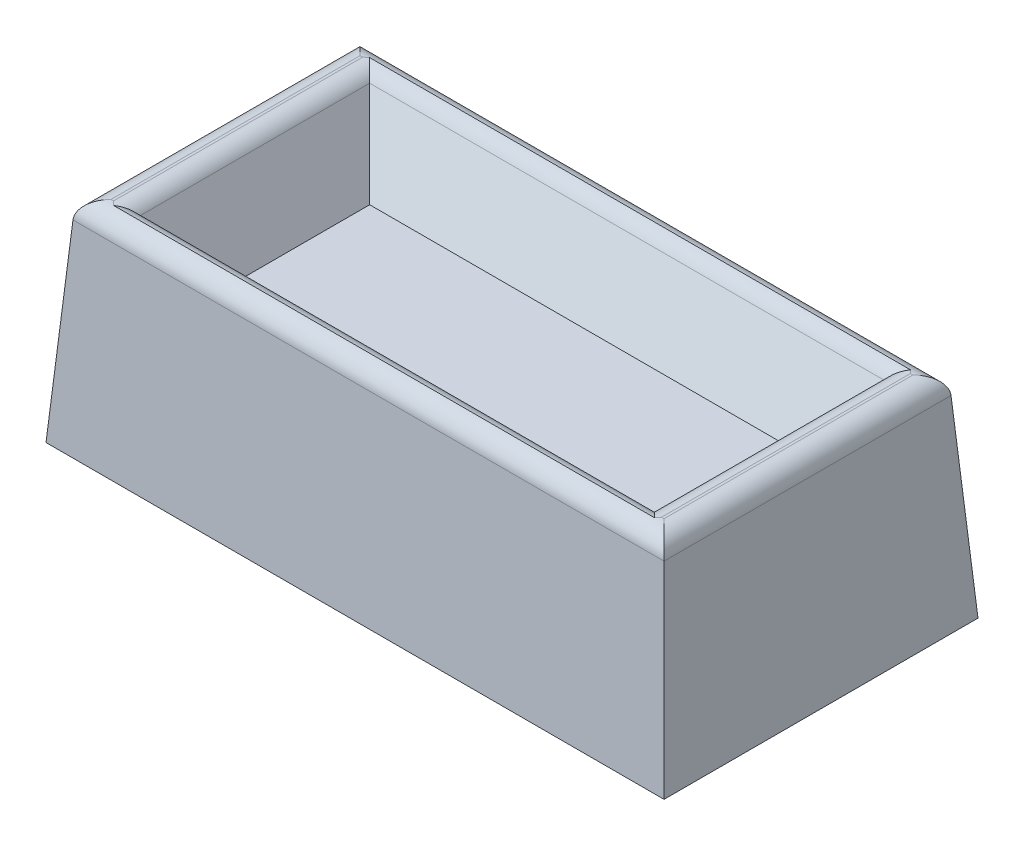
ISO-10303-21;
HEADER;
FILE_DESCRIPTION(('STEP AP214'),'2;1');
FILE_NAME('part.step','',(''),(''),'','','');
FILE_SCHEMA(('AUTOMOTIVE_DESIGN { 1 0 10303 214 1 1 1 1 }'));
ENDSEC;
DATA;
#1=APPLICATION_CONTEXT('core data for automotive mechanical design processes');
#2=APPLICATION_PROTOCOL_DEFINITION('international standard','automotive_design',2000,#1);
#3=PRODUCT_CONTEXT('',#1,'mechanical');
#4=PRODUCT('Part','Part','',(#3));
#5=PRODUCT_RELATED_PRODUCT_CATEGORY('part','',(#4));
#6=PRODUCT_DEFINITION_FORMATION('','',#4);
#7=PRODUCT_DEFINITION_CONTEXT('part definition',#1,'design');
#8=PRODUCT_DEFINITION('design','',#6,#7);
#9=PRODUCT_DEFINITION_SHAPE('','',#8);
#10=(LENGTH_UNIT() NAMED_UNIT(*) SI_UNIT(.MILLI.,.METRE.));
#11=(NAMED_UNIT(*) PLANE_ANGLE_UNIT() SI_UNIT($,.RADIAN.));
#12=(NAMED_UNIT(*) SI_UNIT($,.STERADIAN.) SOLID_ANGLE_UNIT());
#13=UNCERTAINTY_MEASURE_WITH_UNIT(LENGTH_MEASURE(1.E-05),#10,'distance_accuracy_value','');
#14=(GEOMETRIC_REPRESENTATION_CONTEXT(3) GLOBAL_UNCERTAINTY_ASSIGNED_CONTEXT((#13)) GLOBAL_UNIT_ASSIGNED_CONTEXT((#10,
#11,#12)) REPRESENTATION_CONTEXT('',''));
#15=CARTESIAN_POINT('',(0.,0.,0.));
#16=DIRECTION('',(0.,0.,1.));
#17=DIRECTION('',(1.,0.,0.));
#18=AXIS2_PLACEMENT_3D('',#15,#16,#17);
#19=CARTESIAN_POINT('',(0.,0.,0.));
#20=DIRECTION('',(0.,-1.,0.));
#21=DIRECTION('',(0.,0.,-1.));
#22=AXIS2_PLACEMENT_3D('',#19,#20,#21);
#23=PLANE('',#22);
#24=DIRECTION('',(0.,0.,-1.));
#25=VECTOR('',#24,1.);
#26=CARTESIAN_POINT('',(102.892841401862,0.,52.2673742227546));
#27=LINE('',#26,#25);
#28=CARTESIAN_POINT('',(102.892841401862,0.,52.2673742227546));
#29=VERTEX_POINT('',#28);
#30=CARTESIAN_POINT('',(102.892841401862,0.,-52.2673742227546));
#31=VERTEX_POINT('',#30);
#32=EDGE_CURVE('E234',#29,#31,#27,.T.);
#33=ORIENTED_EDGE('',*,*,#32,.F.);
#34=DIRECTION('',(1.,0.,0.));
#35=VECTOR('',#34,1.);
#36=CARTESIAN_POINT('',(-102.892841401862,0.,52.2673742227546));
#37=LINE('',#36,#35);
#38=CARTESIAN_POINT('',(-102.892841401862,0.,52.2673742227546));
#39=VERTEX_POINT('',#38);
#40=EDGE_CURVE('E244',#39,#29,#37,.T.);
#41=ORIENTED_EDGE('',*,*,#40,.F.);
#42=DIRECTION('',(0.,0.,1.));
#43=VECTOR('',#42,1.);
#44=CARTESIAN_POINT('',(-102.892841401862,0.,52.2673742227546));
#45=LINE('',#44,#43);
#46=CARTESIAN_POINT('',(-102.892841401862,0.,-52.2673742227546));
#47=VERTEX_POINT('',#46);
#48=EDGE_CURVE('E241',#47,#39,#45,.T.);
#49=ORIENTED_EDGE('',*,*,#48,.F.);
#50=DIRECTION('',(-1.,0.,0.));
#51=VECTOR('',#50,1.);
#52=CARTESIAN_POINT('',(-102.892841401862,0.,-52.2673742227546));
#53=LINE('',#52,#51);
#54=EDGE_CURVE('E237',#31,#47,#53,.T.);
#55=ORIENTED_EDGE('',*,*,#54,.F.);
#56=EDGE_LOOP('',(#33,#41,#49,#55));
#57=FACE_BOUND('',#56,.T.);
#58=DIRECTION('',(0.,0.,-1.));
#59=VECTOR('',#58,1.);
#60=CARTESIAN_POINT('',(-55.8683845017869,0.,25.4870488631695));
#61=LINE('',#60,#59);
#62=CARTESIAN_POINT('',(-55.8683845017869,0.,-44.6287669593761));
#63=VERTEX_POINT('',#62);
#64=CARTESIAN_POINT('',(-55.8683845017869,0.,44.6287669593761));
#65=VERTEX_POINT('',#64);
#66=EDGE_CURVE('E218',#63,#65,#61,.F.);
#67=ORIENTED_EDGE('',*,*,#66,.F.);
#68=DIRECTION('',(1.,0.,0.));
#69=VECTOR('',#68,1.);
#70=CARTESIAN_POINT('',(0.,0.,-44.6287669593761));
#71=LINE('',#70,#69);
#72=CARTESIAN_POINT('',(-95.254234138484,0.,-44.6287669593761));
#73=VERTEX_POINT('',#72);
#74=EDGE_CURVE('E207',#63,#73,#71,.F.);
#75=ORIENTED_EDGE('',*,*,#74,.T.);
#76=DIRECTION('',(0.,0.,-1.));
#77=VECTOR('',#76,1.);
#78=CARTESIAN_POINT('',(-95.254234138484,0.,0.));
#79=LINE('',#78,#77);
#80=CARTESIAN_POINT('',(-95.254234138484,0.,44.6287669593761));
#81=VERTEX_POINT('',#80);
#82=EDGE_CURVE('E209',#73,#81,#79,.F.);
#83=ORIENTED_EDGE('',*,*,#82,.T.);
#84=DIRECTION('',(-1.,0.,0.));
#85=VECTOR('',#84,1.);
#86=CARTESIAN_POINT('',(0.,0.,44.6287669593761));
#87=LINE('',#86,#85);
#88=EDGE_CURVE('E62',#81,#65,#87,.F.);
#89=ORIENTED_EDGE('',*,*,#88,.T.);
#90=EDGE_LOOP('',(#67,#75,#83,#89));
#91=FACE_BOUND('',#90,.T.);
#92=CARTESIAN_POINT('',(95.254234138484,0.,-44.6287669593761));
#93=VERTEX_POINT('',#92);
#94=CARTESIAN_POINT('',(55.8683845017869,0.,-44.6287669593761));
#95=VERTEX_POINT('',#94);
#96=EDGE_CURVE('E212',#93,#95,#71,.F.);
#97=ORIENTED_EDGE('',*,*,#96,.T.);
#98=DIRECTION('',(0.,0.,-1.));
#99=VECTOR('',#98,1.);
#100=CARTESIAN_POINT('',(55.8683845017869,0.,0.));
#101=LINE('',#100,#99);
#102=CARTESIAN_POINT('',(55.8683845017869,0.,44.6287669593761));
#103=VERTEX_POINT('',#102);
#104=EDGE_CURVE('E205',#95,#103,#101,.F.);
#105=ORIENTED_EDGE('',*,*,#104,.T.);
#106=CARTESIAN_POINT('',(95.254234138484,0.,44.6287669593761));
#107=VERTEX_POINT('',#106);
#108=EDGE_CURVE('E196',#103,#107,#87,.F.);
#109=ORIENTED_EDGE('',*,*,#108,.T.);
#110=DIRECTION('',(0.,0.,1.));
#111=VECTOR('',#110,1.);
#112=CARTESIAN_POINT('',(95.254234138484,0.,0.));
#113=LINE('',#112,#111);
#114=EDGE_CURVE('E54',#107,#93,#113,.F.);
#115=ORIENTED_EDGE('',*,*,#114,.T.);
#116=EDGE_LOOP('',(#97,#105,#109,#115));
#117=FACE_BOUND('',#116,.T.);
#118=ADVANCED_FACE('F37',(#57,#91,#117),#23,.T.);
#119=CARTESIAN_POINT('',(0.,70.104,0.));
#120=DIRECTION('',(0.,-1.,0.));
#121=DIRECTION('',(0.,0.,-1.));
#122=AXIS2_PLACEMENT_3D('',#119,#120,#121);
#123=PLANE('',#122);
#124=DIRECTION('',(0.,0.,-1.));
#125=VECTOR('',#124,1.);
#126=CARTESIAN_POINT('',(-92.0692213804005,70.104,0.));
#127=LINE('',#126,#125);
#128=CARTESIAN_POINT('',(-92.0692213804005,70.104,-41.4437542012926));
#129=VERTEX_POINT('',#128);
#130=CARTESIAN_POINT('',(-92.0692213804005,70.104,41.4437542012926));
#131=VERTEX_POINT('',#130);
#132=EDGE_CURVE('E278',#129,#131,#127,.F.);
#133=ORIENTED_EDGE('',*,*,#132,.T.);
#134=DIRECTION('',(-1.,0.,0.));
#135=VECTOR('',#134,1.);
#136=CARTESIAN_POINT('',(0.,70.104,41.4437542012926));
#137=LINE('',#136,#135);
#138=CARTESIAN_POINT('',(-91.2103038799607,70.104,41.4437542012926));
#139=VERTEX_POINT('',#138);
#140=EDGE_CURVE('E280',#131,#139,#137,.F.);
#141=ORIENTED_EDGE('',*,*,#140,.T.);
#142=DIRECTION('',(0.,0.,-1.));
#143=VECTOR('',#142,1.);
#144=CARTESIAN_POINT('',(-91.2103038799607,70.104,0.));
#145=LINE('',#144,#143);
#146=CARTESIAN_POINT('',(-91.2103038799607,70.104,-41.4437542012926));
#147=VERTEX_POINT('',#146);
#148=EDGE_CURVE('E274',#139,#147,#145,.T.);
#149=ORIENTED_EDGE('',*,*,#148,.T.);
#150=DIRECTION('',(1.,0.,0.));
#151=VECTOR('',#150,1.);
#152=CARTESIAN_POINT('',(0.,70.104,-41.4437542012926));
#153=LINE('',#152,#151);
#154=EDGE_CURVE('E276',#147,#129,#153,.F.);
#155=ORIENTED_EDGE('',*,*,#154,.T.);
#156=EDGE_LOOP('',(#133,#141,#149,#155));
#157=FACE_BOUND('',#156,.T.);
#158=ADVANCED_FACE('F381',(#157),#123,.F.);
#159=CARTESIAN_POINT('',(102.892841401862,0.,52.2673742227546));
#160=DIRECTION('',(0.997564050259824,0.0697564737441253,0.));
#161=DIRECTION('',(-0.0697564737441253,0.997564050259824,0.));
#162=AXIS2_PLACEMENT_3D('',#159,#160,#161);
#163=PLANE('',#162);
#164=DIRECTION('',(0.0695873743166647,-0.995145815783508,-0.0695873743166647));
#165=VECTOR('',#164,1.);
#166=CARTESIAN_POINT('',(101.896344263182,14.2505730060454,-51.2708770840736));
#167=LINE('',#166,#165);
#168=CARTESIAN_POINT('',(98.4037530995504,64.1969536082752,-47.7782859204425));
#169=VERTEX_POINT('',#168);
#170=EDGE_CURVE('E248',#169,#31,#167,.T.);
#171=ORIENTED_EDGE('',*,*,#170,.F.);
#172=DIRECTION('',(0.,0.,-1.));
#173=VECTOR('',#172,1.);
#174=CARTESIAN_POINT('',(98.4037530995504,64.1969536082752,52.2673742227546));
#175=LINE('',#174,#173);
#176=CARTESIAN_POINT('',(98.4037530995504,64.1969536082752,47.7782859204425));
#177=VERTEX_POINT('',#176);
#178=EDGE_CURVE('E290',#169,#177,#175,.F.);
#179=ORIENTED_EDGE('',*,*,#178,.T.);
#180=DIRECTION('',(0.0695873743166647,-0.995145815783508,0.0695873743166647));
#181=VECTOR('',#180,1.);
#182=CARTESIAN_POINT('',(102.892841401862,0.,52.2673742227546));
#183=LINE('',#182,#181);
#184=EDGE_CURVE('E247',#177,#29,#183,.T.);
#185=ORIENTED_EDGE('',*,*,#184,.T.);
#186=ORIENTED_EDGE('',*,*,#32,.T.);
#187=EDGE_LOOP('',(#171,#179,#185,#186));
#188=FACE_BOUND('',#187,.T.);
#189=ADVANCED_FACE('F361',(#188),#163,.T.);
#190=CARTESIAN_POINT('',(-102.892841401862,0.,-52.2673742227546));
#191=DIRECTION('',(0.,0.0697564737441253,-0.997564050259824));
#192=DIRECTION('',(0.,0.997564050259824,0.0697564737441253));
#193=AXIS2_PLACEMENT_3D('',#190,#191,#192);
#194=PLANE('',#193);
#195=DIRECTION('',(-0.0695873743166647,-0.995145815783508,-0.0695873743166647));
#196=VECTOR('',#195,1.);
#197=CARTESIAN_POINT('',(-102.386642057479,7.23898788339008,-51.7611748783715));
#198=LINE('',#197,#196);
#199=CARTESIAN_POINT('',(-98.4037530995504,64.1969536082752,-47.7782859204425));
#200=VERTEX_POINT('',#199);
#201=EDGE_CURVE('E251',#200,#47,#198,.T.);
#202=ORIENTED_EDGE('',*,*,#201,.F.);
#203=DIRECTION('',(-1.,0.,0.));
#204=VECTOR('',#203,1.);
#205=CARTESIAN_POINT('',(-102.892841401862,64.1969536082752,-47.7782859204425));
#206=LINE('',#205,#204);
#207=EDGE_CURVE('E288',#200,#169,#206,.F.);
#208=ORIENTED_EDGE('',*,*,#207,.T.);
#209=ORIENTED_EDGE('',*,*,#170,.T.);
#210=ORIENTED_EDGE('',*,*,#54,.T.);
#211=EDGE_LOOP('',(#202,#208,#209,#210));
#212=FACE_BOUND('',#211,.T.);
#213=ADVANCED_FACE('F377',(#212),#194,.T.);
#214=CARTESIAN_POINT('',(-102.892841401862,0.,52.2673742227546));
#215=DIRECTION('',(-0.997564050259824,0.0697564737441253,0.));
#216=DIRECTION('',(-0.0697564737441253,-0.997564050259824,0.));
#217=AXIS2_PLACEMENT_3D('',#214,#215,#216);
#218=PLANE('',#217);
#219=DIRECTION('',(-0.0695873743166647,-0.995145815783508,0.0695873743166647));
#220=VECTOR('',#219,1.);
#221=CARTESIAN_POINT('',(-102.892841401862,0.,52.2673742227546));
#222=LINE('',#221,#220);
#223=CARTESIAN_POINT('',(-98.4037530995504,64.1969536082752,47.7782859204425));
#224=VERTEX_POINT('',#223);
#225=EDGE_CURVE('E253',#224,#39,#222,.T.);
#226=ORIENTED_EDGE('',*,*,#225,.F.);
#227=DIRECTION('',(0.,0.,1.));
#228=VECTOR('',#227,1.);
#229=CARTESIAN_POINT('',(-98.4037530995504,64.1969536082752,52.2673742227546));
#230=LINE('',#229,#228);
#231=EDGE_CURVE('E286',#224,#200,#230,.F.);
#232=ORIENTED_EDGE('',*,*,#231,.T.);
#233=ORIENTED_EDGE('',*,*,#201,.T.);
#234=ORIENTED_EDGE('',*,*,#48,.T.);
#235=EDGE_LOOP('',(#226,#232,#233,#234));
#236=FACE_BOUND('',#235,.T.);
#237=ADVANCED_FACE('F375',(#236),#218,.T.);
#238=CARTESIAN_POINT('',(-102.892841401862,0.,52.2673742227546));
#239=DIRECTION('',(0.,0.0697564737441253,0.997564050259824));
#240=DIRECTION('',(0.,-0.997564050259824,0.0697564737441253));
#241=AXIS2_PLACEMENT_3D('',#238,#239,#240);
#242=PLANE('',#241);
#243=ORIENTED_EDGE('',*,*,#184,.F.);
#244=DIRECTION('',(1.,0.,0.));
#245=VECTOR('',#244,1.);
#246=CARTESIAN_POINT('',(-102.892841401862,64.1969536082752,47.7782859204425));
#247=LINE('',#246,#245);
#248=EDGE_CURVE('E283',#177,#224,#247,.F.);
#249=ORIENTED_EDGE('',*,*,#248,.T.);
#250=ORIENTED_EDGE('',*,*,#225,.T.);
#251=ORIENTED_EDGE('',*,*,#40,.T.);
#252=EDGE_LOOP('',(#243,#249,#250,#251));
#253=FACE_BOUND('',#252,.T.);
#254=ADVANCED_FACE('F364',(#253),#242,.T.);
#255=DIRECTION('',(-1.,0.,0.));
#256=VECTOR('',#255,1.);
#257=CARTESIAN_POINT('',(0.,70.104,41.4437542012926));
#258=LINE('',#257,#256);
#259=CARTESIAN_POINT('',(91.2103038799607,70.104,41.4437542012926));
#260=VERTEX_POINT('',#259);
#261=CARTESIAN_POINT('',(92.0692213804005,70.104,41.4437542012926));
#262=VERTEX_POINT('',#261);
#263=EDGE_CURVE('E269',#260,#262,#258,.F.);
#264=ORIENTED_EDGE('',*,*,#263,.T.);
#265=DIRECTION('',(0.,0.,1.));
#266=VECTOR('',#265,1.);
#267=CARTESIAN_POINT('',(92.0692213804005,70.104,0.));
#268=LINE('',#267,#266);
#269=CARTESIAN_POINT('',(92.0692213804005,70.104,-41.4437542012926));
#270=VERTEX_POINT('',#269);
#271=EDGE_CURVE('E272',#262,#270,#268,.F.);
#272=ORIENTED_EDGE('',*,*,#271,.T.);
#273=DIRECTION('',(1.,0.,0.));
#274=VECTOR('',#273,1.);
#275=CARTESIAN_POINT('',(0.,70.104,-41.4437542012926));
#276=LINE('',#275,#274);
#277=CARTESIAN_POINT('',(91.2103038799607,70.104,-41.4437542012926));
#278=VERTEX_POINT('',#277);
#279=EDGE_CURVE('E267',#270,#278,#276,.F.);
#280=ORIENTED_EDGE('',*,*,#279,.T.);
#281=DIRECTION('',(0.,0.,1.));
#282=VECTOR('',#281,1.);
#283=CARTESIAN_POINT('',(91.2103038799607,70.104,0.));
#284=LINE('',#283,#282);
#285=EDGE_CURVE('E250',#278,#260,#284,.T.);
#286=ORIENTED_EDGE('',*,*,#285,.T.);
#287=EDGE_LOOP('',(#264,#272,#280,#286));
#288=FACE_BOUND('',#287,.T.);
#289=ADVANCED_FACE('F351',(#288),#123,.F.);
#290=CARTESIAN_POINT('',(72.8794328331901,44.704,25.4870488631695));
#291=DIRECTION('',(-0.866025403784438,0.500000000000001,0.));
#292=DIRECTION('',(-0.500000000000001,-0.866025403784438,0.));
#293=AXIS2_PLACEMENT_3D('',#290,#291,#292);
#294=PLANE('',#293);
#295=DIRECTION('',(0.447213595499959,0.774596669241482,0.447213595499959));
#296=VECTOR('',#295,1.);
#297=CARTESIAN_POINT('',(43.727659699914,-5.78835219755546,-3.66472427010659));
#298=LINE('',#297,#296);
#299=CARTESIAN_POINT('',(72.8794328331901,44.704,25.4870488631695));
#300=VERTEX_POINT('',#299);
#301=CARTESIAN_POINT('',(85.7110425659296,66.929,38.318658595909));
#302=VERTEX_POINT('',#301);
#303=EDGE_CURVE('E238',#300,#302,#298,.T.);
#304=ORIENTED_EDGE('',*,*,#303,.T.);
#305=DIRECTION('',(0.,0.,-1.));
#306=VECTOR('',#305,1.);
#307=CARTESIAN_POINT('',(85.7110425659296,66.929,25.4870488631695));
#308=LINE('',#307,#306);
#309=CARTESIAN_POINT('',(85.7110425659296,66.929,-38.318658595909));
#310=VERTEX_POINT('',#309);
#311=EDGE_CURVE('E46',#302,#310,#308,.T.);
#312=ORIENTED_EDGE('',*,*,#311,.T.);
#313=DIRECTION('',(0.447213595499959,0.774596669241482,-0.447213595499959));
#314=VECTOR('',#313,1.);
#315=CARTESIAN_POINT('',(62.6846132879222,27.0460545735999,-15.2922293179017));
#316=LINE('',#315,#314);
#317=CARTESIAN_POINT('',(72.8794328331901,44.704,-25.4870488631695));
#318=VERTEX_POINT('',#317);
#319=EDGE_CURVE('E233',#318,#310,#316,.T.);
#320=ORIENTED_EDGE('',*,*,#319,.F.);
#321=DIRECTION('',(0.,0.,-1.));
#322=VECTOR('',#321,1.);
#323=CARTESIAN_POINT('',(72.8794328331901,44.704,25.4870488631695));
#324=LINE('',#323,#322);
#325=EDGE_CURVE('E221',#300,#318,#324,.T.);
#326=ORIENTED_EDGE('',*,*,#325,.F.);
#327=EDGE_LOOP('',(#304,#312,#320,#326));
#328=FACE_BOUND('',#327,.T.);
#329=ADVANCED_FACE('F401',(#328),#294,.T.);
#330=CARTESIAN_POINT('',(-72.8794328331901,44.704,25.4870488631695));
#331=DIRECTION('',(0.,0.500000000000001,-0.866025403784438));
#332=DIRECTION('',(0.,0.866025403784438,0.500000000000001));
#333=AXIS2_PLACEMENT_3D('',#330,#331,#332);
#334=PLANE('',#333);
#335=DIRECTION('',(-0.447213595499959,0.774596669241482,0.447213595499959));
#336=VECTOR('',#335,1.);
#337=CARTESIAN_POINT('',(-72.8794328331901,44.704,25.4870488631695));
#338=LINE('',#337,#336);
#339=CARTESIAN_POINT('',(-72.8794328331901,44.704,25.4870488631695));
#340=VERTEX_POINT('',#339);
#341=CARTESIAN_POINT('',(-85.7110425659296,66.929,38.318658595909));
#342=VERTEX_POINT('',#341);
#343=EDGE_CURVE('E258',#340,#342,#338,.T.);
#344=ORIENTED_EDGE('',*,*,#343,.T.);
#345=DIRECTION('',(1.,0.,0.));
#346=VECTOR('',#345,1.);
#347=CARTESIAN_POINT('',(-72.8794328331901,66.929,38.318658595909));
#348=LINE('',#347,#346);
#349=EDGE_CURVE('E295',#342,#302,#348,.T.);
#350=ORIENTED_EDGE('',*,*,#349,.T.);
#351=ORIENTED_EDGE('',*,*,#303,.F.);
#352=DIRECTION('',(1.,0.,0.));
#353=VECTOR('',#352,1.);
#354=CARTESIAN_POINT('',(-72.8794328331901,44.704,25.4870488631695));
#355=LINE('',#354,#353);
#356=EDGE_CURVE('E230',#340,#300,#355,.T.);
#357=ORIENTED_EDGE('',*,*,#356,.F.);
#358=EDGE_LOOP('',(#344,#350,#351,#357));
#359=FACE_BOUND('',#358,.T.);
#360=ADVANCED_FACE('F393',(#359),#334,.T.);
#361=CARTESIAN_POINT('',(-72.8794328331901,44.704,25.4870488631695));
#362=DIRECTION('',(0.866025403784438,0.500000000000001,0.));
#363=DIRECTION('',(-0.500000000000001,0.866025403784438,0.));
#364=AXIS2_PLACEMENT_3D('',#361,#362,#363);
#365=PLANE('',#364);
#366=DIRECTION('',(-0.447213595499959,0.774596669241482,-0.447213595499959));
#367=VECTOR('',#366,1.);
#368=CARTESIAN_POINT('',(-72.8794328331901,44.704,-25.4870488631695));
#369=LINE('',#368,#367);
#370=CARTESIAN_POINT('',(-72.8794328331901,44.704,-25.4870488631695));
#371=VERTEX_POINT('',#370);
#372=CARTESIAN_POINT('',(-85.7110425659296,66.929,-38.318658595909));
#373=VERTEX_POINT('',#372);
#374=EDGE_CURVE('E261',#371,#373,#369,.T.);
#375=ORIENTED_EDGE('',*,*,#374,.T.);
#376=DIRECTION('',(0.,0.,1.));
#377=VECTOR('',#376,1.);
#378=CARTESIAN_POINT('',(-85.7110425659296,66.929,25.4870488631695));
#379=LINE('',#378,#377);
#380=EDGE_CURVE('E292',#373,#342,#379,.T.);
#381=ORIENTED_EDGE('',*,*,#380,.T.);
#382=ORIENTED_EDGE('',*,*,#343,.F.);
#383=DIRECTION('',(0.,0.,1.));
#384=VECTOR('',#383,1.);
#385=CARTESIAN_POINT('',(-72.8794328331901,44.704,25.4870488631695));
#386=LINE('',#385,#384);
#387=EDGE_CURVE('E227',#371,#340,#386,.T.);
#388=ORIENTED_EDGE('',*,*,#387,.F.);
#389=EDGE_LOOP('',(#375,#381,#382,#388));
#390=FACE_BOUND('',#389,.T.);
#391=ADVANCED_FACE('F389',(#390),#365,.T.);
#392=CARTESIAN_POINT('',(-72.8794328331901,44.704,-25.4870488631695));
#393=DIRECTION('',(0.,0.500000000000001,0.866025403784438));
#394=DIRECTION('',(0.,-0.866025403784438,0.500000000000001));
#395=AXIS2_PLACEMENT_3D('',#392,#393,#394);
#396=PLANE('',#395);
#397=ORIENTED_EDGE('',*,*,#319,.T.);
#398=DIRECTION('',(-1.,0.,0.));
#399=VECTOR('',#398,1.);
#400=CARTESIAN_POINT('',(-72.8794328331901,66.929,-38.318658595909));
#401=LINE('',#400,#399);
#402=EDGE_CURVE('E11',#310,#373,#401,.T.);
#403=ORIENTED_EDGE('',*,*,#402,.T.);
#404=ORIENTED_EDGE('',*,*,#374,.F.);
#405=DIRECTION('',(-1.,0.,0.));
#406=VECTOR('',#405,1.);
#407=CARTESIAN_POINT('',(-72.8794328331901,44.704,-25.4870488631695));
#408=LINE('',#407,#406);
#409=EDGE_CURVE('E224',#318,#371,#408,.T.);
#410=ORIENTED_EDGE('',*,*,#409,.F.);
#411=EDGE_LOOP('',(#397,#403,#404,#410));
#412=FACE_BOUND('',#411,.T.);
#413=ADVANCED_FACE('F399',(#412),#396,.T.);
#414=CARTESIAN_POINT('',(0.,44.704,0.));
#415=DIRECTION('',(0.,-1.,0.));
#416=DIRECTION('',(0.,0.,-1.));
#417=AXIS2_PLACEMENT_3D('',#414,#415,#416);
#418=PLANE('',#417);
#419=ORIENTED_EDGE('',*,*,#325,.T.);
#420=ORIENTED_EDGE('',*,*,#409,.T.);
#421=ORIENTED_EDGE('',*,*,#387,.T.);
#422=ORIENTED_EDGE('',*,*,#356,.T.);
#423=EDGE_LOOP('',(#419,#420,#421,#422));
#424=FACE_BOUND('',#423,.T.);
#425=ADVANCED_FACE('F396',(#424),#418,.F.);
#426=CARTESIAN_POINT('',(-72.8794328331901,63.754,-43.8179199099402));
#427=DIRECTION('',(1.,0.,0.));
#428=DIRECTION('',(0.,0.,-1.));
#429=AXIS2_PLACEMENT_3D('',#426,#427,#428);
#430=CYLINDRICAL_SURFACE('',#429,6.35);
#431=DIRECTION('',(1.,0.,0.));
#432=VECTOR('',#431,1.);
#433=CARTESIAN_POINT('',(0.,69.9920553297459,-42.6308370556164));
#434=LINE('',#433,#432);
#435=CARTESIAN_POINT('',(-90.023221025637,69.9920553297459,-42.6308370556164));
#436=VERTEX_POINT('',#435);
#437=CARTESIAN_POINT('',(90.023221025637,69.9920553297459,-42.6308370556164));
#438=VERTEX_POINT('',#437);
#439=EDGE_CURVE('E41',#436,#438,#434,.T.);
#440=ORIENTED_EDGE('',*,*,#439,.F.);
#441=CARTESIAN_POINT('',(-91.2103038799607,63.754,-43.8179199099402));
#442=DIRECTION('',(0.707106781186547,0.,-0.707106781186547));
#443=DIRECTION('',(-0.707106781186547,0.,-0.707106781186547));
#444=AXIS2_PLACEMENT_3D('',#441,#442,#443);
#445=ELLIPSE('',#444,8.98025612106915,6.35);
#446=EDGE_CURVE('E322',#373,#436,#445,.F.);
#447=ORIENTED_EDGE('',*,*,#446,.F.);
#448=ORIENTED_EDGE('',*,*,#402,.F.);
#449=CARTESIAN_POINT('',(91.2103038799608,63.754,-43.8179199099402));
#450=DIRECTION('',(0.707106781186547,0.,0.707106781186547));
#451=DIRECTION('',(-0.707106781186547,0.,0.707106781186547));
#452=AXIS2_PLACEMENT_3D('',#449,#450,#451);
#453=ELLIPSE('',#452,8.98025612106915,6.35);
#454=EDGE_CURVE('E315',#438,#310,#453,.T.);
#455=ORIENTED_EDGE('',*,*,#454,.F.);
#456=EDGE_LOOP('',(#440,#447,#448,#455));
#457=FACE_BOUND('',#456,.T.);
#458=ADVANCED_FACE('F39',(#457),#430,.T.);
#459=CARTESIAN_POINT('',(0.,63.754,-41.4437542012926));
#460=DIRECTION('',(1.,0.,0.));
#461=DIRECTION('',(0.,0.,-1.));
#462=AXIS2_PLACEMENT_3D('',#459,#460,#461);
#463=CYLINDRICAL_SURFACE('',#462,6.35);
#464=CARTESIAN_POINT('',(92.0692213804005,63.754,-41.4437542012926));
#465=DIRECTION('',(0.707106781186547,0.,0.707106781186547));
#466=DIRECTION('',(-0.707106781186547,0.,0.707106781186547));
#467=AXIS2_PLACEMENT_3D('',#464,#465,#466);
#468=ELLIPSE('',#467,8.98025612106915,6.35);
#469=EDGE_CURVE('E309',#169,#270,#468,.T.);
#470=ORIENTED_EDGE('',*,*,#469,.F.);
#471=ORIENTED_EDGE('',*,*,#207,.F.);
#472=CARTESIAN_POINT('',(-92.0692213804005,63.754,-41.4437542012926));
#473=DIRECTION('',(0.707106781186547,0.,-0.707106781186547));
#474=DIRECTION('',(0.707106781186547,0.,0.707106781186547));
#475=AXIS2_PLACEMENT_3D('',#472,#473,#474);
#476=ELLIPSE('',#475,8.98025612106915,6.35);
#477=EDGE_CURVE('E327',#129,#200,#476,.F.);
#478=ORIENTED_EDGE('',*,*,#477,.F.);
#479=ORIENTED_EDGE('',*,*,#154,.F.);
#480=CARTESIAN_POINT('',(-91.2103038799607,63.754,-41.4437542012926));
#481=DIRECTION('',(0.707106781186547,0.,0.707106781186547));
#482=DIRECTION('',(0.707106781186547,0.,-0.707106781186547));
#483=AXIS2_PLACEMENT_3D('',#480,#481,#482);
#484=ELLIPSE('',#483,8.98025612106915,6.35);
#485=EDGE_CURVE('E325',#436,#147,#484,.T.);
#486=ORIENTED_EDGE('',*,*,#485,.F.);
#487=ORIENTED_EDGE('',*,*,#439,.T.);
#488=CARTESIAN_POINT('',(91.2103038799607,63.754,-41.4437542012926));
#489=DIRECTION('',(0.707106781186547,0.,-0.707106781186547));
#490=DIRECTION('',(0.707106781186547,0.,0.707106781186547));
#491=AXIS2_PLACEMENT_3D('',#488,#489,#490);
#492=ELLIPSE('',#491,8.98025612106915,6.35);
#493=EDGE_CURVE('E312',#278,#438,#492,.F.);
#494=ORIENTED_EDGE('',*,*,#493,.F.);
#495=ORIENTED_EDGE('',*,*,#279,.F.);
#496=EDGE_LOOP('',(#470,#471,#478,#479,#486,#487,#494,#495));
#497=FACE_BOUND('',#496,.T.);
#498=ADVANCED_FACE('F338',(#497),#463,.T.);
#499=CARTESIAN_POINT('',(-92.0692213804005,63.754,0.));
#500=DIRECTION('',(0.,0.,-1.));
#501=DIRECTION('',(-1.,0.,0.));
#502=AXIS2_PLACEMENT_3D('',#499,#500,#501);
#503=CYLINDRICAL_SURFACE('',#502,6.35);
#504=ORIENTED_EDGE('',*,*,#477,.T.);
#505=ORIENTED_EDGE('',*,*,#231,.F.);
#506=CARTESIAN_POINT('',(-92.0692213804005,63.754,41.4437542012926));
#507=DIRECTION('',(-0.707106781186547,0.,-0.707106781186547));
#508=DIRECTION('',(0.707106781186547,0.,-0.707106781186547));
#509=AXIS2_PLACEMENT_3D('',#506,#507,#508);
#510=ELLIPSE('',#509,8.98025612106915,6.35);
#511=EDGE_CURVE('E307',#131,#224,#510,.F.);
#512=ORIENTED_EDGE('',*,*,#511,.F.);
#513=ORIENTED_EDGE('',*,*,#132,.F.);
#514=EDGE_LOOP('',(#504,#505,#512,#513));
#515=FACE_BOUND('',#514,.T.);
#516=ADVANCED_FACE('F372',(#515),#503,.T.);
#517=CARTESIAN_POINT('',(-91.2103038799607,63.754,25.4870488631695));
#518=DIRECTION('',(0.,0.,-1.));
#519=DIRECTION('',(-1.,0.,0.));
#520=AXIS2_PLACEMENT_3D('',#517,#518,#519);
#521=CYLINDRICAL_SURFACE('',#520,6.35);
#522=CARTESIAN_POINT('',(-91.2103038799607,63.754,43.8179199099402));
#523=DIRECTION('',(-0.707106781186547,0.,-0.707106781186547));
#524=DIRECTION('',(0.707106781186547,0.,-0.707106781186547));
#525=AXIS2_PLACEMENT_3D('',#522,#523,#524);
#526=ELLIPSE('',#525,8.98025612106915,6.35);
#527=CARTESIAN_POINT('',(-90.023221025637,69.9920553297459,42.6308370556164));
#528=VERTEX_POINT('',#527);
#529=EDGE_CURVE('E320',#342,#528,#526,.F.);
#530=ORIENTED_EDGE('',*,*,#529,.F.);
#531=ORIENTED_EDGE('',*,*,#380,.F.);
#532=ORIENTED_EDGE('',*,*,#446,.T.);
#533=ORIENTED_EDGE('',*,*,#485,.T.);
#534=ORIENTED_EDGE('',*,*,#148,.F.);
#535=CARTESIAN_POINT('',(-91.2103038799607,63.754,41.4437542012926));
#536=DIRECTION('',(-0.707106781186547,0.,0.707106781186547));
#537=DIRECTION('',(-0.707106781186547,0.,-0.707106781186547));
#538=AXIS2_PLACEMENT_3D('',#535,#536,#537);
#539=ELLIPSE('',#538,8.98025612106915,6.35);
#540=EDGE_CURVE('E305',#528,#139,#539,.T.);
#541=ORIENTED_EDGE('',*,*,#540,.F.);
#542=EDGE_LOOP('',(#530,#531,#532,#533,#534,#541));
#543=FACE_BOUND('',#542,.T.);
#544=ADVANCED_FACE('F386',(#543),#521,.T.);
#545=CARTESIAN_POINT('',(-72.8794328331901,63.754,43.8179199099402));
#546=DIRECTION('',(-1.,0.,0.));
#547=DIRECTION('',(0.,0.,1.));
#548=AXIS2_PLACEMENT_3D('',#545,#546,#547);
#549=CYLINDRICAL_SURFACE('',#548,6.35);
#550=CARTESIAN_POINT('',(91.2103038799608,63.754,43.8179199099402));
#551=DIRECTION('',(-0.707106781186547,0.,0.707106781186547));
#552=DIRECTION('',(-0.707106781186547,0.,-0.707106781186547));
#553=AXIS2_PLACEMENT_3D('',#550,#551,#552);
#554=ELLIPSE('',#553,8.98025612106915,6.35);
#555=CARTESIAN_POINT('',(90.023221025637,69.9920553297459,42.6308370556164));
#556=VERTEX_POINT('',#555);
#557=EDGE_CURVE('E318',#302,#556,#554,.F.);
#558=ORIENTED_EDGE('',*,*,#557,.F.);
#559=ORIENTED_EDGE('',*,*,#349,.F.);
#560=ORIENTED_EDGE('',*,*,#529,.T.);
#561=DIRECTION('',(-1.,0.,0.));
#562=VECTOR('',#561,1.);
#563=CARTESIAN_POINT('',(0.,69.9920553297459,42.6308370556164));
#564=LINE('',#563,#562);
#565=EDGE_CURVE('E302',#556,#528,#564,.T.);
#566=ORIENTED_EDGE('',*,*,#565,.F.);
#567=EDGE_LOOP('',(#558,#559,#560,#566));
#568=FACE_BOUND('',#567,.T.);
#569=ADVANCED_FACE('F405',(#568),#549,.T.);
#570=CARTESIAN_POINT('',(91.2103038799607,63.754,25.4870488631695));
#571=DIRECTION('',(0.,0.,1.));
#572=DIRECTION('',(1.,0.,0.));
#573=AXIS2_PLACEMENT_3D('',#570,#571,#572);
#574=CYLINDRICAL_SURFACE('',#573,6.35);
#575=ORIENTED_EDGE('',*,*,#311,.F.);
#576=ORIENTED_EDGE('',*,*,#557,.T.);
#577=CARTESIAN_POINT('',(91.2103038799607,63.754,41.4437542012926));
#578=DIRECTION('',(-0.707106781186547,0.,-0.707106781186547));
#579=DIRECTION('',(-0.707106781186547,0.,0.707106781186547));
#580=AXIS2_PLACEMENT_3D('',#577,#578,#579);
#581=ELLIPSE('',#580,8.98025612106915,6.35);
#582=EDGE_CURVE('E299',#260,#556,#581,.F.);
#583=ORIENTED_EDGE('',*,*,#582,.F.);
#584=ORIENTED_EDGE('',*,*,#285,.F.);
#585=ORIENTED_EDGE('',*,*,#493,.T.);
#586=ORIENTED_EDGE('',*,*,#454,.T.);
#587=EDGE_LOOP('',(#575,#576,#583,#584,#585,#586));
#588=FACE_BOUND('',#587,.T.);
#589=ADVANCED_FACE('F347',(#588),#574,.T.);
#590=CARTESIAN_POINT('',(92.0692213804005,63.754,0.));
#591=DIRECTION('',(0.,0.,1.));
#592=DIRECTION('',(1.,0.,0.));
#593=AXIS2_PLACEMENT_3D('',#590,#591,#592);
#594=CYLINDRICAL_SURFACE('',#593,6.35);
#595=ORIENTED_EDGE('',*,*,#469,.T.);
#596=ORIENTED_EDGE('',*,*,#271,.F.);
#597=CARTESIAN_POINT('',(92.0692213804005,63.754,41.4437542012926));
#598=DIRECTION('',(-0.707106781186547,0.,0.707106781186547));
#599=DIRECTION('',(0.707106781186547,0.,0.707106781186547));
#600=AXIS2_PLACEMENT_3D('',#597,#598,#599);
#601=ELLIPSE('',#600,8.98025612106915,6.35);
#602=EDGE_CURVE('E220',#177,#262,#601,.T.);
#603=ORIENTED_EDGE('',*,*,#602,.F.);
#604=ORIENTED_EDGE('',*,*,#178,.F.);
#605=EDGE_LOOP('',(#595,#596,#603,#604));
#606=FACE_BOUND('',#605,.T.);
#607=ADVANCED_FACE('F356',(#606),#594,.T.);
#608=CARTESIAN_POINT('',(0.,63.754,41.4437542012926));
#609=DIRECTION('',(-1.,0.,0.));
#610=DIRECTION('',(0.,0.,1.));
#611=AXIS2_PLACEMENT_3D('',#608,#609,#610);
#612=CYLINDRICAL_SURFACE('',#611,6.35);
#613=ORIENTED_EDGE('',*,*,#511,.T.);
#614=ORIENTED_EDGE('',*,*,#248,.F.);
#615=ORIENTED_EDGE('',*,*,#602,.T.);
#616=ORIENTED_EDGE('',*,*,#263,.F.);
#617=ORIENTED_EDGE('',*,*,#582,.T.);
#618=ORIENTED_EDGE('',*,*,#565,.T.);
#619=ORIENTED_EDGE('',*,*,#540,.T.);
#620=ORIENTED_EDGE('',*,*,#140,.F.);
#621=EDGE_LOOP('',(#613,#614,#615,#616,#617,#618,#619,#620));
#622=FACE_BOUND('',#621,.T.);
#623=ADVANCED_FACE('F369',(#622),#612,.T.);
#624=CARTESIAN_POINT('',(-79.4785464100275,40.894,25.4870488631695));
#625=DIRECTION('',(0.866025403784438,0.500000000000001,0.));
#626=DIRECTION('',(-0.500000000000001,0.866025403784438,0.));
#627=AXIS2_PLACEMENT_3D('',#624,#625,#626);
#628=PLANE('',#627);
#629=ORIENTED_EDGE('',*,*,#66,.T.);
#630=DIRECTION('',(0.499085684230875,-0.864441762418151,0.0604476565567308));
#631=VECTOR('',#630,1.);
#632=CARTESIAN_POINT('',(-79.9697548580283,41.7447979890444,41.7096863207764));
#633=LINE('',#632,#631);
#634=CARTESIAN_POINT('',(-90.9992914237516,60.8485157048158,40.3738242446437));
#635=VERTEX_POINT('',#634);
#636=EDGE_CURVE('E192',#635,#65,#633,.T.);
#637=ORIENTED_EDGE('',*,*,#636,.F.);
#638=DIRECTION('',(0.,0.,-1.));
#639=VECTOR('',#638,1.);
#640=CARTESIAN_POINT('',(-90.9992914237516,60.8485157048158,52.2673742227546));
#641=LINE('',#640,#639);
#642=CARTESIAN_POINT('',(-90.9992914237516,60.8485157048159,-40.3738242446437));
#643=VERTEX_POINT('',#642);
#644=EDGE_CURVE('E216',#635,#643,#641,.T.);
#645=ORIENTED_EDGE('',*,*,#644,.T.);
#646=DIRECTION('',(-0.499085684230875,0.864441762418151,0.0604476565567308));
#647=VECTOR('',#646,1.);
#648=CARTESIAN_POINT('',(-81.5075699854016,44.4083719223029,-41.5234310872478));
#649=LINE('',#648,#647);
#650=EDGE_CURVE('E198',#63,#643,#649,.T.);
#651=ORIENTED_EDGE('',*,*,#650,.F.);
#652=EDGE_LOOP('',(#629,#637,#645,#651));
#653=FACE_BOUND('',#652,.T.);
#654=ADVANCED_FACE('F444',(#653),#628,.F.);
#655=CARTESIAN_POINT('',(-102.892841401862,-0.531544329930235,44.6659361597748));
#656=DIRECTION('',(0.,0.0697564737441253,0.997564050259824));
#657=DIRECTION('',(0.,-0.997564050259824,0.0697564737441253));
#658=AXIS2_PLACEMENT_3D('',#655,#656,#657);
#659=PLANE('',#658);
#660=ORIENTED_EDGE('',*,*,#88,.F.);
#661=DIRECTION('',(-0.0695873743166647,-0.995145815783508,0.0695873743166647));
#662=VECTOR('',#661,1.);
#663=CARTESIAN_POINT('',(-95.3282125628112,-1.05794075650159,44.7027453837034));
#664=LINE('',#663,#662);
#665=EDGE_CURVE('E183',#635,#81,#664,.T.);
#666=ORIENTED_EDGE('',*,*,#665,.F.);
#667=ORIENTED_EDGE('',*,*,#636,.T.);
#668=EDGE_LOOP('',(#660,#666,#667));
#669=FACE_BOUND('',#668,.T.);
#670=ADVANCED_FACE('F508',(#669),#659,.F.);
#671=CARTESIAN_POINT('',(-95.2914033388826,-0.531544329930235,52.2673742227546));
#672=DIRECTION('',(-0.997564050259824,0.0697564737441253,0.));
#673=DIRECTION('',(-0.0697564737441253,-0.997564050259824,0.));
#674=AXIS2_PLACEMENT_3D('',#671,#672,#673);
#675=PLANE('',#674);
#676=ORIENTED_EDGE('',*,*,#665,.T.);
#677=ORIENTED_EDGE('',*,*,#82,.F.);
#678=DIRECTION('',(-0.0695873743166647,-0.995145815783508,-0.0695873743166647));
#679=VECTOR('',#678,1.);
#680=CARTESIAN_POINT('',(-94.8220132184281,6.18104712688849,-44.1965460393202));
#681=LINE('',#680,#679);
#682=EDGE_CURVE('E675',#643,#73,#681,.T.);
#683=ORIENTED_EDGE('',*,*,#682,.F.);
#684=ORIENTED_EDGE('',*,*,#644,.F.);
#685=EDGE_LOOP('',(#676,#677,#683,#684));
#686=FACE_BOUND('',#685,.T.);
#687=ADVANCED_FACE('F498',(#686),#675,.F.);
#688=CARTESIAN_POINT('',(-102.892841401862,-0.531544329930235,-44.6659361597748));
#689=DIRECTION('',(0.,0.0697564737441253,-0.997564050259824));
#690=DIRECTION('',(0.,0.997564050259824,0.0697564737441253));
#691=AXIS2_PLACEMENT_3D('',#688,#689,#690);
#692=PLANE('',#691);
#693=ORIENTED_EDGE('',*,*,#682,.T.);
#694=ORIENTED_EDGE('',*,*,#74,.F.);
#695=ORIENTED_EDGE('',*,*,#650,.T.);
#696=EDGE_LOOP('',(#693,#694,#695));
#697=FACE_BOUND('',#696,.T.);
#698=ADVANCED_FACE('F488',(#697),#692,.F.);
#699=DIRECTION('',(0.499085684230875,0.864441762418151,-0.0604476565567308));
#700=VECTOR('',#699,1.);
#701=CARTESIAN_POINT('',(79.9697548580283,41.7447979890444,41.7096863207764));
#702=LINE('',#701,#700);
#703=CARTESIAN_POINT('',(90.9992914237516,60.8485157048158,40.3738242446437));
#704=VERTEX_POINT('',#703);
#705=EDGE_CURVE('E188',#103,#704,#702,.T.);
#706=ORIENTED_EDGE('',*,*,#705,.T.);
#707=DIRECTION('',(0.0695873743166647,-0.995145815783508,0.0695873743166647));
#708=VECTOR('',#707,1.);
#709=CARTESIAN_POINT('',(95.3282125628112,-1.05794075650159,44.7027453837034));
#710=LINE('',#709,#708);
#711=EDGE_CURVE('E175',#704,#107,#710,.T.);
#712=ORIENTED_EDGE('',*,*,#711,.T.);
#713=ORIENTED_EDGE('',*,*,#108,.F.);
#714=EDGE_LOOP('',(#706,#712,#713));
#715=FACE_BOUND('',#714,.T.);
#716=ADVANCED_FACE('F195',(#715),#659,.F.);
#717=CARTESIAN_POINT('',(95.2914033388826,-0.531544329930235,52.2673742227546));
#718=DIRECTION('',(0.997564050259824,0.0697564737441253,0.));
#719=DIRECTION('',(-0.0697564737441253,0.997564050259824,0.));
#720=AXIS2_PLACEMENT_3D('',#717,#718,#719);
#721=PLANE('',#720);
#722=DIRECTION('',(0.0695873743166647,-0.995145815783508,-0.0695873743166647));
#723=VECTOR('',#722,1.);
#724=CARTESIAN_POINT('',(94.3317154241302,13.1926322495438,-43.7062482450224));
#725=LINE('',#724,#723);
#726=CARTESIAN_POINT('',(90.9992914237516,60.8485157048158,-40.3738242446437));
#727=VERTEX_POINT('',#726);
#728=EDGE_CURVE('E193',#727,#93,#725,.T.);
#729=ORIENTED_EDGE('',*,*,#728,.T.);
#730=ORIENTED_EDGE('',*,*,#114,.F.);
#731=ORIENTED_EDGE('',*,*,#711,.F.);
#732=DIRECTION('',(0.,0.,-1.));
#733=VECTOR('',#732,1.);
#734=CARTESIAN_POINT('',(90.9992914237516,60.8485157048158,25.4870488631695));
#735=LINE('',#734,#733);
#736=EDGE_CURVE('E178',#704,#727,#735,.T.);
#737=ORIENTED_EDGE('',*,*,#736,.T.);
#738=EDGE_LOOP('',(#729,#730,#731,#737));
#739=FACE_BOUND('',#738,.T.);
#740=ADVANCED_FACE('F177',(#739),#721,.F.);
#741=ORIENTED_EDGE('',*,*,#96,.F.);
#742=ORIENTED_EDGE('',*,*,#728,.F.);
#743=DIRECTION('',(-0.499085684230875,-0.864441762418151,-0.0604476565567308));
#744=VECTOR('',#743,1.);
#745=CARTESIAN_POINT('',(81.5075699854016,44.4083719223029,-41.5234310872478));
#746=LINE('',#745,#744);
#747=EDGE_CURVE('E191',#727,#95,#746,.T.);
#748=ORIENTED_EDGE('',*,*,#747,.T.);
#749=EDGE_LOOP('',(#741,#742,#748));
#750=FACE_BOUND('',#749,.T.);
#751=ADVANCED_FACE('F475',(#750),#692,.F.);
#752=CARTESIAN_POINT('',(79.4785464100275,40.894,25.4870488631695));
#753=DIRECTION('',(-0.866025403784438,0.500000000000001,0.));
#754=DIRECTION('',(-0.500000000000001,-0.866025403784438,0.));
#755=AXIS2_PLACEMENT_3D('',#752,#753,#754);
#756=PLANE('',#755);
#757=ORIENTED_EDGE('',*,*,#747,.F.);
#758=ORIENTED_EDGE('',*,*,#736,.F.);
#759=ORIENTED_EDGE('',*,*,#705,.F.);
#760=ORIENTED_EDGE('',*,*,#104,.F.);
#761=EDGE_LOOP('',(#757,#758,#759,#760));
#762=FACE_BOUND('',#761,.T.);
#763=ADVANCED_FACE('F187',(#762),#756,.F.);
#764=CLOSED_SHELL('',(#118,#158,#189,#213,#237,#254,#289,#329,#360,#391,#413,#425,#458,#498,
#516,#544,#569,#589,#607,#623,#654,#670,#687,#698,#716,#740,#751,#763));
#765=MANIFOLD_SOLID_BREP('B2',#764);
#766=ADVANCED_BREP_SHAPE_REPRESENTATION('',(#18,#765),#14);
#767=SHAPE_DEFINITION_REPRESENTATION(#9,#766);
ENDSEC;
END-ISO-10303-21;
